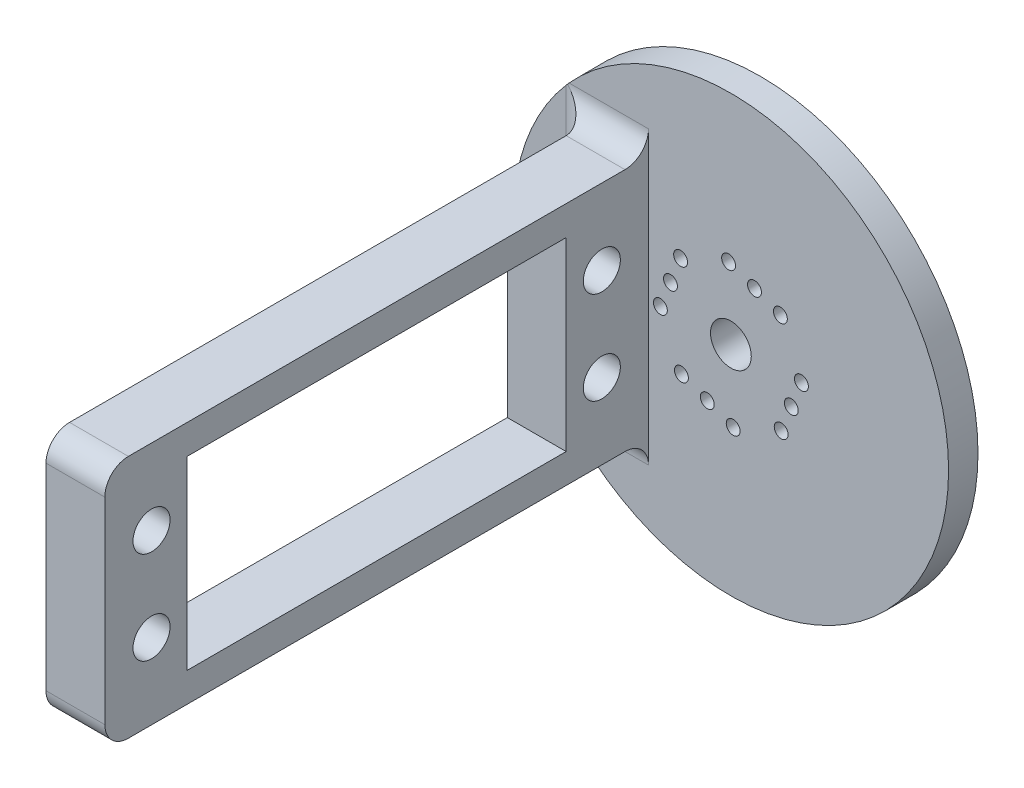
ISO-10303-21;
HEADER;
FILE_DESCRIPTION(('STEP AP214'),'2;1');
FILE_NAME('part.step','',(''),(''),'','','');
FILE_SCHEMA(('AUTOMOTIVE_DESIGN { 1 0 10303 214 1 1 1 1 }'));
ENDSEC;
DATA;
#1=APPLICATION_CONTEXT('core data for automotive mechanical design processes');
#2=APPLICATION_PROTOCOL_DEFINITION('international standard','automotive_design',2000,#1);
#3=PRODUCT_CONTEXT('',#1,'mechanical');
#4=PRODUCT('Part','Part','',(#3));
#5=PRODUCT_RELATED_PRODUCT_CATEGORY('part','',(#4));
#6=PRODUCT_DEFINITION_FORMATION('','',#4);
#7=PRODUCT_DEFINITION_CONTEXT('part definition',#1,'design');
#8=PRODUCT_DEFINITION('design','',#6,#7);
#9=PRODUCT_DEFINITION_SHAPE('','',#8);
#10=(LENGTH_UNIT() NAMED_UNIT(*) SI_UNIT(.MILLI.,.METRE.));
#11=(NAMED_UNIT(*) PLANE_ANGLE_UNIT() SI_UNIT($,.RADIAN.));
#12=(NAMED_UNIT(*) SI_UNIT($,.STERADIAN.) SOLID_ANGLE_UNIT());
#13=UNCERTAINTY_MEASURE_WITH_UNIT(LENGTH_MEASURE(1.E-05),#10,'distance_accuracy_value','');
#14=(GEOMETRIC_REPRESENTATION_CONTEXT(3) GLOBAL_UNCERTAINTY_ASSIGNED_CONTEXT((#13)) GLOBAL_UNIT_ASSIGNED_CONTEXT((#10,
#11,#12)) REPRESENTATION_CONTEXT('',''));
#15=CARTESIAN_POINT('',(0.,0.,0.));
#16=DIRECTION('',(0.,0.,1.));
#17=DIRECTION('',(1.,0.,0.));
#18=AXIS2_PLACEMENT_3D('',#15,#16,#17);
#19=CARTESIAN_POINT('',(0.,0.,3.175));
#20=DIRECTION('',(0.,0.,1.));
#21=DIRECTION('',(1.,0.,0.));
#22=AXIS2_PLACEMENT_3D('',#19,#20,#21);
#23=PLANE('',#22);
#24=CARTESIAN_POINT('',(0.,0.,3.175));
#25=DIRECTION('',(0.,0.,1.));
#26=DIRECTION('',(1.,0.,0.));
#27=AXIS2_PLACEMENT_3D('',#24,#25,#26);
#28=CIRCLE('',#27,2.2);
#29=CARTESIAN_POINT('',(2.2,0.,3.175));
#30=VERTEX_POINT('',#29);
#31=EDGE_CURVE('E432',#30,#30,#28,.T.);
#32=ORIENTED_EDGE('',*,*,#31,.F.);
#33=EDGE_LOOP('',(#32));
#34=FACE_BOUND('',#33,.T.);
#35=CARTESIAN_POINT('',(-2.54776954508794,-6.51988269412283,3.175));
#36=DIRECTION('',(0.,0.,1.));
#37=DIRECTION('',(1.,0.,0.));
#38=AXIS2_PLACEMENT_3D('',#35,#36,#37);
#39=CIRCLE('',#38,0.749999999999999);
#40=CARTESIAN_POINT('',(-1.79776954508794,-6.51988269412283,3.175));
#41=VERTEX_POINT('',#40);
#42=EDGE_CURVE('E436',#41,#41,#39,.F.);
#43=ORIENTED_EDGE('',*,*,#42,.T.);
#44=EDGE_LOOP('',(#43));
#45=FACE_BOUND('',#44,.T.);
#46=CARTESIAN_POINT('',(0.24646589525042,-7.61178392773195,3.175));
#47=DIRECTION('',(0.,0.,1.));
#48=DIRECTION('',(1.,0.,0.));
#49=AXIS2_PLACEMENT_3D('',#46,#47,#48);
#50=CIRCLE('',#49,0.749999999999999);
#51=CARTESIAN_POINT('',(0.996465895250419,-7.61178392773195,3.175));
#52=VERTEX_POINT('',#51);
#53=EDGE_CURVE('E440',#52,#52,#50,.F.);
#54=ORIENTED_EDGE('',*,*,#53,.T.);
#55=EDGE_LOOP('',(#54));
#56=FACE_BOUND('',#55,.T.);
#57=CARTESIAN_POINT('',(5.42798146051372,-5.34200498542629,3.175));
#58=DIRECTION('',(0.,0.,1.));
#59=DIRECTION('',(1.,0.,0.));
#60=AXIS2_PLACEMENT_3D('',#57,#58,#59);
#61=CIRCLE('',#60,0.749999999999999);
#62=CARTESIAN_POINT('',(6.17798146051372,-5.34200498542629,3.175));
#63=VERTEX_POINT('',#62);
#64=EDGE_CURVE('E444',#63,#63,#61,.F.);
#65=ORIENTED_EDGE('',*,*,#64,.T.);
#66=EDGE_LOOP('',(#65));
#67=FACE_BOUND('',#66,.T.);
#68=CARTESIAN_POINT('',(6.51988269412283,-2.54776954508794,3.175));
#69=DIRECTION('',(0.,0.,1.));
#70=DIRECTION('',(1.,0.,0.));
#71=AXIS2_PLACEMENT_3D('',#68,#69,#70);
#72=CIRCLE('',#71,0.749999999999999);
#73=CARTESIAN_POINT('',(7.26988269412283,-2.54776954508794,3.175));
#74=VERTEX_POINT('',#73);
#75=EDGE_CURVE('E448',#74,#74,#72,.F.);
#76=ORIENTED_EDGE('',*,*,#75,.T.);
#77=EDGE_LOOP('',(#76));
#78=FACE_BOUND('',#77,.T.);
#79=CARTESIAN_POINT('',(7.61178392773195,0.246465895250422,3.175));
#80=DIRECTION('',(0.,0.,1.));
#81=DIRECTION('',(1.,0.,0.));
#82=AXIS2_PLACEMENT_3D('',#79,#80,#81);
#83=CIRCLE('',#82,0.749999999999999);
#84=CARTESIAN_POINT('',(8.36178392773195,0.246465895250422,3.175));
#85=VERTEX_POINT('',#84);
#86=EDGE_CURVE('E452',#85,#85,#83,.F.);
#87=ORIENTED_EDGE('',*,*,#86,.T.);
#88=EDGE_LOOP('',(#87));
#89=FACE_BOUND('',#88,.T.);
#90=CARTESIAN_POINT('',(5.34200498542629,5.42798146051372,3.175));
#91=DIRECTION('',(0.,0.,1.));
#92=DIRECTION('',(1.,0.,0.));
#93=AXIS2_PLACEMENT_3D('',#90,#91,#92);
#94=CIRCLE('',#93,0.749999999999999);
#95=CARTESIAN_POINT('',(6.09200498542629,5.42798146051372,3.175));
#96=VERTEX_POINT('',#95);
#97=EDGE_CURVE('E456',#96,#96,#94,.F.);
#98=ORIENTED_EDGE('',*,*,#97,.T.);
#99=EDGE_LOOP('',(#98));
#100=FACE_BOUND('',#99,.T.);
#101=CARTESIAN_POINT('',(2.54776954508794,6.51988269412283,3.175));
#102=DIRECTION('',(0.,0.,1.));
#103=DIRECTION('',(1.,0.,0.));
#104=AXIS2_PLACEMENT_3D('',#101,#102,#103);
#105=CIRCLE('',#104,0.750000000000001);
#106=CARTESIAN_POINT('',(3.29776954508794,6.51988269412283,3.175));
#107=VERTEX_POINT('',#106);
#108=EDGE_CURVE('E460',#107,#107,#105,.F.);
#109=ORIENTED_EDGE('',*,*,#108,.T.);
#110=EDGE_LOOP('',(#109));
#111=FACE_BOUND('',#110,.T.);
#112=CARTESIAN_POINT('',(-0.246465895250421,7.61178392773195,3.175));
#113=DIRECTION('',(0.,0.,1.));
#114=DIRECTION('',(1.,0.,0.));
#115=AXIS2_PLACEMENT_3D('',#112,#113,#114);
#116=CIRCLE('',#115,0.75);
#117=CARTESIAN_POINT('',(0.503534104749579,7.61178392773195,3.175));
#118=VERTEX_POINT('',#117);
#119=EDGE_CURVE('E464',#118,#118,#116,.F.);
#120=ORIENTED_EDGE('',*,*,#119,.T.);
#121=EDGE_LOOP('',(#120));
#122=FACE_BOUND('',#121,.T.);
#123=CARTESIAN_POINT('',(-5.42798146051372,5.34200498542629,3.175));
#124=DIRECTION('',(0.,0.,1.));
#125=DIRECTION('',(1.,0.,0.));
#126=AXIS2_PLACEMENT_3D('',#123,#124,#125);
#127=CIRCLE('',#126,0.749999999999999);
#128=CARTESIAN_POINT('',(-4.67798146051372,5.34200498542629,3.175));
#129=VERTEX_POINT('',#128);
#130=EDGE_CURVE('E468',#129,#129,#127,.F.);
#131=ORIENTED_EDGE('',*,*,#130,.T.);
#132=EDGE_LOOP('',(#131));
#133=FACE_BOUND('',#132,.T.);
#134=CARTESIAN_POINT('',(-6.51988269412283,2.54776954508794,3.175));
#135=DIRECTION('',(0.,0.,1.));
#136=DIRECTION('',(1.,0.,0.));
#137=AXIS2_PLACEMENT_3D('',#134,#135,#136);
#138=CIRCLE('',#137,0.749999999999999);
#139=CARTESIAN_POINT('',(-5.76988269412283,2.54776954508794,3.175));
#140=VERTEX_POINT('',#139);
#141=EDGE_CURVE('E472',#140,#140,#138,.F.);
#142=ORIENTED_EDGE('',*,*,#141,.T.);
#143=EDGE_LOOP('',(#142));
#144=FACE_BOUND('',#143,.T.);
#145=CARTESIAN_POINT('',(-7.61178392773195,-0.246465895250421,3.175));
#146=DIRECTION('',(0.,0.,1.));
#147=DIRECTION('',(1.,0.,0.));
#148=AXIS2_PLACEMENT_3D('',#145,#146,#147);
#149=CIRCLE('',#148,0.749999999999999);
#150=CARTESIAN_POINT('',(-6.86178392773195,-0.246465895250421,3.175));
#151=VERTEX_POINT('',#150);
#152=EDGE_CURVE('E476',#151,#151,#149,.F.);
#153=ORIENTED_EDGE('',*,*,#152,.T.);
#154=EDGE_LOOP('',(#153));
#155=FACE_BOUND('',#154,.T.);
#156=CARTESIAN_POINT('',(-5.34200498542629,-5.42798146051372,3.175));
#157=DIRECTION('',(0.,0.,1.));
#158=DIRECTION('',(1.,0.,0.));
#159=AXIS2_PLACEMENT_3D('',#156,#157,#158);
#160=CIRCLE('',#159,0.750000000000001);
#161=CARTESIAN_POINT('',(-4.59200498542629,-5.42798146051372,3.175));
#162=VERTEX_POINT('',#161);
#163=EDGE_CURVE('E182',#162,#162,#160,.F.);
#164=ORIENTED_EDGE('',*,*,#163,.T.);
#165=EDGE_LOOP('',(#164));
#166=FACE_BOUND('',#165,.T.);
#167=CARTESIAN_POINT('',(0.,0.,3.175));
#168=DIRECTION('',(0.,0.,1.));
#169=DIRECTION('',(1.,0.,0.));
#170=AXIS2_PLACEMENT_3D('',#167,#168,#169);
#171=CIRCLE('',#170,23.495);
#172=CARTESIAN_POINT('',(-17.465789418174,-15.715,3.175));
#173=VERTEX_POINT('',#172);
#174=CARTESIAN_POINT('',(-17.465789418174,15.715,3.175));
#175=VERTEX_POINT('',#174);
#176=EDGE_CURVE('E263',#173,#175,#171,.T.);
#177=ORIENTED_EDGE('',*,*,#176,.T.);
#178=DIRECTION('',(1.,0.,0.));
#179=VECTOR('',#178,1.);
#180=CARTESIAN_POINT('',(-8.89,15.715,3.175));
#181=LINE('',#180,#179);
#182=CARTESIAN_POINT('',(-8.89,15.715,3.17500000000001));
#183=VERTEX_POINT('',#182);
#184=EDGE_CURVE('E277',#175,#183,#181,.T.);
#185=ORIENTED_EDGE('',*,*,#184,.T.);
#186=DIRECTION('',(0.,1.,0.));
#187=VECTOR('',#186,1.);
#188=CARTESIAN_POINT('',(-8.89,13.175,3.17500000000001));
#189=LINE('',#188,#187);
#190=CARTESIAN_POINT('',(-8.89,-15.715,3.175));
#191=VERTEX_POINT('',#190);
#192=EDGE_CURVE('E235',#191,#183,#189,.T.);
#193=ORIENTED_EDGE('',*,*,#192,.F.);
#194=DIRECTION('',(1.,0.,0.));
#195=VECTOR('',#194,1.);
#196=CARTESIAN_POINT('',(-15.24,-15.715,3.175));
#197=LINE('',#196,#195);
#198=EDGE_CURVE('E274',#191,#173,#197,.F.);
#199=ORIENTED_EDGE('',*,*,#198,.T.);
#200=EDGE_LOOP('',(#177,#185,#193,#199));
#201=FACE_BOUND('',#200,.T.);
#202=ADVANCED_FACE('F45',(#34,#45,#56,#67,#78,#89,#100,#111,#122,#133,#144,#155,#166,#201),#23,.T.);
#203=CARTESIAN_POINT('',(0.,0.,3.175));
#204=DIRECTION('',(0.,0.,-1.));
#205=DIRECTION('',(-1.,0.,0.));
#206=AXIS2_PLACEMENT_3D('',#203,#204,#205);
#207=CYLINDRICAL_SURFACE('',#206,23.495);
#208=CARTESIAN_POINT('',(-17.78,15.3586010105087,3.175));
#209=VERTEX_POINT('',#208);
#210=CARTESIAN_POINT('',(-17.78,-15.3586010105087,3.175));
#211=VERTEX_POINT('',#210);
#212=EDGE_CURVE('E267',#209,#211,#171,.T.);
#213=ORIENTED_EDGE('',*,*,#212,.F.);
#214=CARTESIAN_POINT('',(-17.78,15.3586010105087,3.175));
#215=CARTESIAN_POINT('',(-17.7524673102431,15.3904742718305,3.17499412421482));
#216=CARTESIAN_POINT('',(-17.7248558568099,15.4222657097279,3.17544447569739));
#217=CARTESIAN_POINT('',(-17.6694754225914,15.4856849386731,3.17725763319801));
#218=CARTESIAN_POINT('',(-17.6417064418061,15.517312729721,3.17862043921604));
#219=CARTESIAN_POINT('',(-17.6138586973444,15.5488586973445,3.18043947250181));
#220=B_SPLINE_CURVE_WITH_KNOTS('',3,(#214,#215,#216,#217,#218,#219),.UNSPECIFIED.,.F.,.F.,(4,2,
4),(0.,0.126331374988894,0.252662749975528),.UNSPECIFIED.);
#221=CARTESIAN_POINT('',(-17.6138586973444,15.5488586973445,3.18043947250181));
#222=VERTEX_POINT('',#221);
#223=EDGE_CURVE('E324',#209,#222,#220,.T.);
#224=ORIENTED_EDGE('',*,*,#223,.T.);
#225=CARTESIAN_POINT('',(-17.6138586973444,15.5488586973445,3.18043947250181));
#226=CARTESIAN_POINT('',(-17.5893264354966,15.5766491773507,3.17862230868545));
#227=CARTESIAN_POINT('',(-17.5647211979752,15.6043895259085,3.17726043740213));
#228=CARTESIAN_POINT('',(-17.5153647715851,15.659769960127,3.17544727990152));
#229=CARTESIAN_POINT('',(-17.4906135827163,15.6874100457878,3.17499599368424));
#230=CARTESIAN_POINT('',(-17.465789418174,15.715,3.175));
#231=B_SPLINE_CURVE_WITH_KNOTS('',3,(#225,#226,#227,#228,#229,#230),.UNSPECIFIED.,.F.,.F.,(4,2,
4),(0.,0.111315740597761,0.222631481196376),.UNSPECIFIED.);
#232=EDGE_CURVE('E295',#222,#175,#231,.T.);
#233=ORIENTED_EDGE('',*,*,#232,.T.);
#234=ORIENTED_EDGE('',*,*,#176,.F.);
#235=CARTESIAN_POINT('',(-17.465789418174,-15.715,3.175));
#236=CARTESIAN_POINT('',(-17.4906135827163,-15.6874100457878,3.17499599368424));
#237=CARTESIAN_POINT('',(-17.5153647715851,-15.659769960127,3.17544727990152));
#238=CARTESIAN_POINT('',(-17.5647211979752,-15.6043895259085,3.17726043740213));
#239=CARTESIAN_POINT('',(-17.5893264354966,-15.5766491773507,3.17862230868545));
#240=CARTESIAN_POINT('',(-17.6138586973444,-15.5488586973444,3.18043947250181));
#241=B_SPLINE_CURVE_WITH_KNOTS('',3,(#235,#236,#237,#238,#239,#240),.UNSPECIFIED.,.F.,.F.,(4,2,
4),(0.,0.111315740598613,0.222631481196368),.UNSPECIFIED.);
#242=CARTESIAN_POINT('',(-17.6138586973444,-15.5488586973444,3.18043947250181));
#243=VERTEX_POINT('',#242);
#244=EDGE_CURVE('E391',#173,#243,#241,.T.);
#245=ORIENTED_EDGE('',*,*,#244,.T.);
#246=CARTESIAN_POINT('',(-17.6138586973444,-15.5488586973444,3.18043947250181));
#247=CARTESIAN_POINT('',(-17.6417064418061,-15.517312729721,3.17862043921604));
#248=CARTESIAN_POINT('',(-17.6694754225914,-15.4856849386731,3.17725763319801));
#249=CARTESIAN_POINT('',(-17.7248558568099,-15.4222657097279,3.17544447569739));
#250=CARTESIAN_POINT('',(-17.7524673102431,-15.3904742718305,3.17499412421482));
#251=CARTESIAN_POINT('',(-17.78,-15.3586010105087,3.175));
#252=B_SPLINE_CURVE_WITH_KNOTS('',3,(#246,#247,#248,#249,#250,#251),.UNSPECIFIED.,.F.,.F.,(4,2,
4),(0.,0.12633137498663,0.252662749975517),.UNSPECIFIED.);
#253=EDGE_CURVE('E330',#243,#211,#252,.T.);
#254=ORIENTED_EDGE('',*,*,#253,.T.);
#255=EDGE_LOOP('',(#213,#224,#233,#234,#245,#254));
#256=FACE_BOUND('',#255,.T.);
#257=CARTESIAN_POINT('',(0.,0.,0.));
#258=DIRECTION('',(0.,0.,1.));
#259=DIRECTION('',(1.,0.,0.));
#260=AXIS2_PLACEMENT_3D('',#257,#258,#259);
#261=CIRCLE('',#260,23.495);
#262=CARTESIAN_POINT('',(23.495,0.,0.));
#263=VERTEX_POINT('',#262);
#264=EDGE_CURVE('E250',#263,#263,#261,.T.);
#265=ORIENTED_EDGE('',*,*,#264,.T.);
#266=EDGE_LOOP('',(#265));
#267=FACE_BOUND('',#266,.T.);
#268=ADVANCED_FACE('F306',(#256,#267),#207,.T.);
#269=ORIENTED_EDGE('',*,*,#212,.T.);
#270=DIRECTION('',(0.,1.,0.));
#271=VECTOR('',#270,1.);
#272=CARTESIAN_POINT('',(-17.78,13.175,3.175));
#273=LINE('',#272,#271);
#274=EDGE_CURVE('E271',#211,#209,#273,.T.);
#275=ORIENTED_EDGE('',*,*,#274,.T.);
#276=EDGE_LOOP('',(#269,#275));
#277=FACE_BOUND('',#276,.T.);
#278=ADVANCED_FACE('F412',(#277),#23,.T.);
#279=CARTESIAN_POINT('',(0.,0.,0.));
#280=DIRECTION('',(0.,0.,1.));
#281=DIRECTION('',(1.,0.,0.));
#282=AXIS2_PLACEMENT_3D('',#279,#280,#281);
#283=PLANE('',#282);
#284=CARTESIAN_POINT('',(0.,0.,0.));
#285=DIRECTION('',(0.,0.,1.));
#286=DIRECTION('',(1.,0.,0.));
#287=AXIS2_PLACEMENT_3D('',#284,#285,#286);
#288=CIRCLE('',#287,2.2);
#289=CARTESIAN_POINT('',(2.2,0.,0.));
#290=VERTEX_POINT('',#289);
#291=EDGE_CURVE('E557',#290,#290,#288,.T.);
#292=ORIENTED_EDGE('',*,*,#291,.T.);
#293=EDGE_LOOP('',(#292));
#294=FACE_BOUND('',#293,.T.);
#295=CARTESIAN_POINT('',(-2.54776954508794,-6.51988269412283,0.));
#296=DIRECTION('',(0.,0.,-1.));
#297=DIRECTION('',(-1.,0.,0.));
#298=AXIS2_PLACEMENT_3D('',#295,#296,#297);
#299=CIRCLE('',#298,0.749999999999999);
#300=CARTESIAN_POINT('',(-3.29776954508794,-6.51988269412283,0.));
#301=VERTEX_POINT('',#300);
#302=EDGE_CURVE('E481',#301,#301,#299,.T.);
#303=ORIENTED_EDGE('',*,*,#302,.F.);
#304=EDGE_LOOP('',(#303));
#305=FACE_BOUND('',#304,.T.);
#306=CARTESIAN_POINT('',(0.24646589525042,-7.61178392773195,0.));
#307=DIRECTION('',(0.,0.,-1.));
#308=DIRECTION('',(-1.,0.,0.));
#309=AXIS2_PLACEMENT_3D('',#306,#307,#308);
#310=CIRCLE('',#309,0.749999999999999);
#311=CARTESIAN_POINT('',(-0.503534104749579,-7.61178392773195,0.));
#312=VERTEX_POINT('',#311);
#313=EDGE_CURVE('E490',#312,#312,#310,.T.);
#314=ORIENTED_EDGE('',*,*,#313,.F.);
#315=EDGE_LOOP('',(#314));
#316=FACE_BOUND('',#315,.T.);
#317=CARTESIAN_POINT('',(5.42798146051372,-5.34200498542629,0.));
#318=DIRECTION('',(0.,0.,-1.));
#319=DIRECTION('',(-1.,0.,0.));
#320=AXIS2_PLACEMENT_3D('',#317,#318,#319);
#321=CIRCLE('',#320,0.749999999999999);
#322=CARTESIAN_POINT('',(4.67798146051372,-5.34200498542629,0.));
#323=VERTEX_POINT('',#322);
#324=EDGE_CURVE('E500',#323,#323,#321,.T.);
#325=ORIENTED_EDGE('',*,*,#324,.F.);
#326=EDGE_LOOP('',(#325));
#327=FACE_BOUND('',#326,.T.);
#328=CARTESIAN_POINT('',(6.51988269412283,-2.54776954508794,0.));
#329=DIRECTION('',(0.,0.,-1.));
#330=DIRECTION('',(-1.,0.,0.));
#331=AXIS2_PLACEMENT_3D('',#328,#329,#330);
#332=CIRCLE('',#331,0.749999999999999);
#333=CARTESIAN_POINT('',(5.76988269412283,-2.54776954508794,0.));
#334=VERTEX_POINT('',#333);
#335=EDGE_CURVE('E506',#334,#334,#332,.T.);
#336=ORIENTED_EDGE('',*,*,#335,.F.);
#337=EDGE_LOOP('',(#336));
#338=FACE_BOUND('',#337,.T.);
#339=CARTESIAN_POINT('',(7.61178392773195,0.246465895250422,0.));
#340=DIRECTION('',(0.,0.,-1.));
#341=DIRECTION('',(-1.,0.,0.));
#342=AXIS2_PLACEMENT_3D('',#339,#340,#341);
#343=CIRCLE('',#342,0.749999999999999);
#344=CARTESIAN_POINT('',(6.86178392773195,0.246465895250422,0.));
#345=VERTEX_POINT('',#344);
#346=EDGE_CURVE('E512',#345,#345,#343,.T.);
#347=ORIENTED_EDGE('',*,*,#346,.F.);
#348=EDGE_LOOP('',(#347));
#349=FACE_BOUND('',#348,.T.);
#350=CARTESIAN_POINT('',(5.34200498542629,5.42798146051372,0.));
#351=DIRECTION('',(0.,0.,-1.));
#352=DIRECTION('',(-1.,0.,0.));
#353=AXIS2_PLACEMENT_3D('',#350,#351,#352);
#354=CIRCLE('',#353,0.749999999999999);
#355=CARTESIAN_POINT('',(4.59200498542629,5.42798146051372,0.));
#356=VERTEX_POINT('',#355);
#357=EDGE_CURVE('E518',#356,#356,#354,.T.);
#358=ORIENTED_EDGE('',*,*,#357,.F.);
#359=EDGE_LOOP('',(#358));
#360=FACE_BOUND('',#359,.T.);
#361=CARTESIAN_POINT('',(2.54776954508794,6.51988269412283,0.));
#362=DIRECTION('',(0.,0.,-1.));
#363=DIRECTION('',(-1.,0.,0.));
#364=AXIS2_PLACEMENT_3D('',#361,#362,#363);
#365=CIRCLE('',#364,0.750000000000001);
#366=CARTESIAN_POINT('',(1.79776954508794,6.51988269412283,0.));
#367=VERTEX_POINT('',#366);
#368=EDGE_CURVE('E524',#367,#367,#365,.T.);
#369=ORIENTED_EDGE('',*,*,#368,.F.);
#370=EDGE_LOOP('',(#369));
#371=FACE_BOUND('',#370,.T.);
#372=CARTESIAN_POINT('',(-0.246465895250421,7.61178392773195,0.));
#373=DIRECTION('',(0.,0.,-1.));
#374=DIRECTION('',(-1.,0.,0.));
#375=AXIS2_PLACEMENT_3D('',#372,#373,#374);
#376=CIRCLE('',#375,0.75);
#377=CARTESIAN_POINT('',(-0.996465895250421,7.61178392773195,0.));
#378=VERTEX_POINT('',#377);
#379=EDGE_CURVE('E530',#378,#378,#376,.T.);
#380=ORIENTED_EDGE('',*,*,#379,.F.);
#381=EDGE_LOOP('',(#380));
#382=FACE_BOUND('',#381,.T.);
#383=CARTESIAN_POINT('',(-5.42798146051372,5.34200498542629,0.));
#384=DIRECTION('',(0.,0.,-1.));
#385=DIRECTION('',(-1.,0.,0.));
#386=AXIS2_PLACEMENT_3D('',#383,#384,#385);
#387=CIRCLE('',#386,0.749999999999999);
#388=CARTESIAN_POINT('',(-6.17798146051372,5.34200498542629,0.));
#389=VERTEX_POINT('',#388);
#390=EDGE_CURVE('E535',#389,#389,#387,.T.);
#391=ORIENTED_EDGE('',*,*,#390,.F.);
#392=EDGE_LOOP('',(#391));
#393=FACE_BOUND('',#392,.T.);
#394=CARTESIAN_POINT('',(-6.51988269412283,2.54776954508794,0.));
#395=DIRECTION('',(0.,0.,-1.));
#396=DIRECTION('',(-1.,0.,0.));
#397=AXIS2_PLACEMENT_3D('',#394,#395,#396);
#398=CIRCLE('',#397,0.749999999999999);
#399=CARTESIAN_POINT('',(-7.26988269412283,2.54776954508794,0.));
#400=VERTEX_POINT('',#399);
#401=EDGE_CURVE('E542',#400,#400,#398,.T.);
#402=ORIENTED_EDGE('',*,*,#401,.F.);
#403=EDGE_LOOP('',(#402));
#404=FACE_BOUND('',#403,.T.);
#405=CARTESIAN_POINT('',(-7.61178392773195,-0.246465895250421,0.));
#406=DIRECTION('',(0.,0.,-1.));
#407=DIRECTION('',(-1.,0.,0.));
#408=AXIS2_PLACEMENT_3D('',#405,#406,#407);
#409=CIRCLE('',#408,0.749999999999999);
#410=CARTESIAN_POINT('',(-8.36178392773195,-0.246465895250421,0.));
#411=VERTEX_POINT('',#410);
#412=EDGE_CURVE('E551',#411,#411,#409,.T.);
#413=ORIENTED_EDGE('',*,*,#412,.F.);
#414=EDGE_LOOP('',(#413));
#415=FACE_BOUND('',#414,.T.);
#416=CARTESIAN_POINT('',(-5.34200498542629,-5.42798146051372,0.));
#417=DIRECTION('',(0.,0.,-1.));
#418=DIRECTION('',(-1.,0.,0.));
#419=AXIS2_PLACEMENT_3D('',#416,#417,#418);
#420=CIRCLE('',#419,0.750000000000001);
#421=CARTESIAN_POINT('',(-6.0920049854263,-5.42798146051372,0.));
#422=VERTEX_POINT('',#421);
#423=EDGE_CURVE('E342',#422,#422,#420,.T.);
#424=ORIENTED_EDGE('',*,*,#423,.F.);
#425=EDGE_LOOP('',(#424));
#426=FACE_BOUND('',#425,.T.);
#427=ORIENTED_EDGE('',*,*,#264,.F.);
#428=EDGE_LOOP('',(#427));
#429=FACE_BOUND('',#428,.T.);
#430=ADVANCED_FACE('F415',(#294,#305,#316,#327,#338,#349,#360,#371,#382,#393,#404,#415,#426,
#429),#283,.F.);
#431=CARTESIAN_POINT('',(-15.24,-13.175,3.175));
#432=DIRECTION('',(0.,-1.,0.));
#433=DIRECTION('',(0.,0.,-1.));
#434=AXIS2_PLACEMENT_3D('',#431,#432,#433);
#435=PLANE('',#434);
#436=DIRECTION('',(0.,0.,-1.));
#437=VECTOR('',#436,1.);
#438=CARTESIAN_POINT('',(-8.89,-13.175,3.175));
#439=LINE('',#438,#437);
#440=CARTESIAN_POINT('',(-8.89,-13.175,59.315));
#441=VERTEX_POINT('',#440);
#442=CARTESIAN_POINT('',(-8.89,-13.175,5.715));
#443=VERTEX_POINT('',#442);
#444=EDGE_CURVE('E244',#441,#443,#439,.T.);
#445=ORIENTED_EDGE('',*,*,#444,.F.);
#446=DIRECTION('',(1.,0.,0.));
#447=VECTOR('',#446,1.);
#448=CARTESIAN_POINT('',(-15.24,-13.175,59.315));
#449=LINE('',#448,#447);
#450=CARTESIAN_POINT('',(-15.24,-13.175,59.315));
#451=VERTEX_POINT('',#450);
#452=EDGE_CURVE('E11',#441,#451,#449,.F.);
#453=ORIENTED_EDGE('',*,*,#452,.T.);
#454=DIRECTION('',(0.,0.,-1.));
#455=VECTOR('',#454,1.);
#456=CARTESIAN_POINT('',(-15.24,-13.175,3.175));
#457=LINE('',#456,#455);
#458=CARTESIAN_POINT('',(-15.24,-13.175,5.715));
#459=VERTEX_POINT('',#458);
#460=EDGE_CURVE('E247',#451,#459,#457,.T.);
#461=ORIENTED_EDGE('',*,*,#460,.T.);
#462=DIRECTION('',(1.,0.,0.));
#463=VECTOR('',#462,1.);
#464=CARTESIAN_POINT('',(-8.89,-13.175,5.715));
#465=LINE('',#464,#463);
#466=EDGE_CURVE('E284',#459,#443,#465,.T.);
#467=ORIENTED_EDGE('',*,*,#466,.T.);
#468=EDGE_LOOP('',(#445,#453,#461,#467));
#469=FACE_BOUND('',#468,.T.);
#470=ADVANCED_FACE('F383',(#469),#435,.T.);
#471=CARTESIAN_POINT('',(-15.24,13.175,61.855));
#472=DIRECTION('',(0.,0.,1.));
#473=DIRECTION('',(0.,-1.,0.));
#474=AXIS2_PLACEMENT_3D('',#471,#472,#473);
#475=PLANE('',#474);
#476=DIRECTION('',(0.,-1.,0.));
#477=VECTOR('',#476,1.);
#478=CARTESIAN_POINT('',(-8.89,13.175,61.855));
#479=LINE('',#478,#477);
#480=CARTESIAN_POINT('',(-8.89,10.635,61.855));
#481=VERTEX_POINT('',#480);
#482=CARTESIAN_POINT('',(-8.89,-10.635,61.855));
#483=VERTEX_POINT('',#482);
#484=EDGE_CURVE('E257',#481,#483,#479,.T.);
#485=ORIENTED_EDGE('',*,*,#484,.F.);
#486=DIRECTION('',(1.,0.,0.));
#487=VECTOR('',#486,1.);
#488=CARTESIAN_POINT('',(-15.24,10.635,61.855));
#489=LINE('',#488,#487);
#490=CARTESIAN_POINT('',(-15.24,10.635,61.855));
#491=VERTEX_POINT('',#490);
#492=EDGE_CURVE('E359',#481,#491,#489,.F.);
#493=ORIENTED_EDGE('',*,*,#492,.T.);
#494=DIRECTION('',(0.,-1.,0.));
#495=VECTOR('',#494,1.);
#496=CARTESIAN_POINT('',(-15.24,13.175,61.855));
#497=LINE('',#496,#495);
#498=CARTESIAN_POINT('',(-15.24,-10.635,61.855));
#499=VERTEX_POINT('',#498);
#500=EDGE_CURVE('E243',#491,#499,#497,.T.);
#501=ORIENTED_EDGE('',*,*,#500,.T.);
#502=DIRECTION('',(1.,0.,0.));
#503=VECTOR('',#502,1.);
#504=CARTESIAN_POINT('',(-15.24,-10.635,61.855));
#505=LINE('',#504,#503);
#506=EDGE_CURVE('E355',#499,#483,#505,.T.);
#507=ORIENTED_EDGE('',*,*,#506,.T.);
#508=EDGE_LOOP('',(#485,#493,#501,#507));
#509=FACE_BOUND('',#508,.T.);
#510=ADVANCED_FACE('F379',(#509),#475,.T.);
#511=CARTESIAN_POINT('',(-15.24,13.175,3.17500000000001));
#512=DIRECTION('',(0.,1.,0.));
#513=DIRECTION('',(0.,0.,1.));
#514=AXIS2_PLACEMENT_3D('',#511,#512,#513);
#515=PLANE('',#514);
#516=DIRECTION('',(0.,0.,1.));
#517=VECTOR('',#516,1.);
#518=CARTESIAN_POINT('',(-15.24,13.175,3.17500000000001));
#519=LINE('',#518,#517);
#520=CARTESIAN_POINT('',(-15.24,13.175,5.715));
#521=VERTEX_POINT('',#520);
#522=CARTESIAN_POINT('',(-15.24,13.175,59.315));
#523=VERTEX_POINT('',#522);
#524=EDGE_CURVE('E239',#521,#523,#519,.T.);
#525=ORIENTED_EDGE('',*,*,#524,.T.);
#526=DIRECTION('',(1.,0.,0.));
#527=VECTOR('',#526,1.);
#528=CARTESIAN_POINT('',(-15.24,13.175,59.315));
#529=LINE('',#528,#527);
#530=CARTESIAN_POINT('',(-8.89,13.175,59.315));
#531=VERTEX_POINT('',#530);
#532=EDGE_CURVE('E337',#523,#531,#529,.T.);
#533=ORIENTED_EDGE('',*,*,#532,.T.);
#534=DIRECTION('',(0.,0.,1.));
#535=VECTOR('',#534,1.);
#536=CARTESIAN_POINT('',(-8.89,13.175,3.17500000000001));
#537=LINE('',#536,#535);
#538=CARTESIAN_POINT('',(-8.89,13.175,5.715));
#539=VERTEX_POINT('',#538);
#540=EDGE_CURVE('E253',#539,#531,#537,.T.);
#541=ORIENTED_EDGE('',*,*,#540,.F.);
#542=DIRECTION('',(1.,0.,0.));
#543=VECTOR('',#542,1.);
#544=CARTESIAN_POINT('',(-15.24,13.175,5.715));
#545=LINE('',#544,#543);
#546=EDGE_CURVE('E281',#539,#521,#545,.F.);
#547=ORIENTED_EDGE('',*,*,#546,.T.);
#548=EDGE_LOOP('',(#525,#533,#541,#547));
#549=FACE_BOUND('',#548,.T.);
#550=ADVANCED_FACE('F371',(#549),#515,.T.);
#551=CARTESIAN_POINT('',(-15.24,0.,0.));
#552=DIRECTION('',(-1.,0.,0.));
#553=DIRECTION('',(0.,0.,1.));
#554=AXIS2_PLACEMENT_3D('',#551,#552,#553);
#555=PLANE('',#554);
#556=DIRECTION('',(0.,0.,-1.));
#557=VECTOR('',#556,1.);
#558=CARTESIAN_POINT('',(-15.24,-10.,12.065));
#559=LINE('',#558,#557);
#560=CARTESIAN_POINT('',(-15.24,-10.,52.965));
#561=VERTEX_POINT('',#560);
#562=CARTESIAN_POINT('',(-15.24,-10.,12.065));
#563=VERTEX_POINT('',#562);
#564=EDGE_CURVE('E151',#561,#563,#559,.T.);
#565=ORIENTED_EDGE('',*,*,#564,.T.);
#566=DIRECTION('',(0.,1.,0.));
#567=VECTOR('',#566,1.);
#568=CARTESIAN_POINT('',(-15.24,-10.,12.065));
#569=LINE('',#568,#567);
#570=CARTESIAN_POINT('',(-15.24,10.,12.065));
#571=VERTEX_POINT('',#570);
#572=EDGE_CURVE('E164',#563,#571,#569,.T.);
#573=ORIENTED_EDGE('',*,*,#572,.T.);
#574=DIRECTION('',(0.,0.,1.));
#575=VECTOR('',#574,1.);
#576=CARTESIAN_POINT('',(-15.24,10.,12.065));
#577=LINE('',#576,#575);
#578=CARTESIAN_POINT('',(-15.24,9.99999999999998,52.965));
#579=VERTEX_POINT('',#578);
#580=EDGE_CURVE('E169',#571,#579,#577,.T.);
#581=ORIENTED_EDGE('',*,*,#580,.T.);
#582=DIRECTION('',(0.,-1.,0.));
#583=VECTOR('',#582,1.);
#584=CARTESIAN_POINT('',(-15.24,-10.,52.965));
#585=LINE('',#584,#583);
#586=EDGE_CURVE('E160',#579,#561,#585,.T.);
#587=ORIENTED_EDGE('',*,*,#586,.T.);
#588=EDGE_LOOP('',(#565,#573,#581,#587));
#589=FACE_BOUND('',#588,.T.);
#590=CARTESIAN_POINT('',(-15.24,4.99999999999998,8.21500000000001));
#591=DIRECTION('',(1.,0.,0.));
#592=DIRECTION('',(0.,0.,-1.));
#593=AXIS2_PLACEMENT_3D('',#590,#591,#592);
#594=CIRCLE('',#593,2.);
#595=CARTESIAN_POINT('',(-15.24,4.99999999999998,6.215));
#596=VERTEX_POINT('',#595);
#597=EDGE_CURVE('E207',#596,#596,#594,.T.);
#598=ORIENTED_EDGE('',*,*,#597,.T.);
#599=EDGE_LOOP('',(#598));
#600=FACE_BOUND('',#599,.T.);
#601=CARTESIAN_POINT('',(-15.24,-5.00000000000002,8.21500000000001));
#602=DIRECTION('',(1.,0.,0.));
#603=DIRECTION('',(0.,0.,-1.));
#604=AXIS2_PLACEMENT_3D('',#601,#602,#603);
#605=CIRCLE('',#604,2.00000000000001);
#606=CARTESIAN_POINT('',(-15.24,-5.00000000000002,6.215));
#607=VERTEX_POINT('',#606);
#608=EDGE_CURVE('E215',#607,#607,#605,.T.);
#609=ORIENTED_EDGE('',*,*,#608,.T.);
#610=EDGE_LOOP('',(#609));
#611=FACE_BOUND('',#610,.T.);
#612=CARTESIAN_POINT('',(-15.24,4.99999999999997,56.815));
#613=DIRECTION('',(1.,0.,0.));
#614=DIRECTION('',(0.,0.,-1.));
#615=AXIS2_PLACEMENT_3D('',#612,#613,#614);
#616=CIRCLE('',#615,2.);
#617=CARTESIAN_POINT('',(-15.24,4.99999999999997,54.815));
#618=VERTEX_POINT('',#617);
#619=EDGE_CURVE('E223',#618,#618,#616,.T.);
#620=ORIENTED_EDGE('',*,*,#619,.T.);
#621=EDGE_LOOP('',(#620));
#622=FACE_BOUND('',#621,.T.);
#623=CARTESIAN_POINT('',(-15.24,-5.00000000000003,56.815));
#624=DIRECTION('',(1.,0.,0.));
#625=DIRECTION('',(0.,0.,-1.));
#626=AXIS2_PLACEMENT_3D('',#623,#624,#625);
#627=CIRCLE('',#626,2.00000000000002);
#628=CARTESIAN_POINT('',(-15.24,-5.00000000000003,54.815));
#629=VERTEX_POINT('',#628);
#630=EDGE_CURVE('E231',#629,#629,#627,.T.);
#631=ORIENTED_EDGE('',*,*,#630,.T.);
#632=EDGE_LOOP('',(#631));
#633=FACE_BOUND('',#632,.T.);
#634=ORIENTED_EDGE('',*,*,#500,.F.);
#635=CARTESIAN_POINT('',(-15.24,10.635,59.315));
#636=DIRECTION('',(-1.,0.,0.));
#637=DIRECTION('',(0.,0.,1.));
#638=AXIS2_PLACEMENT_3D('',#635,#636,#637);
#639=CIRCLE('',#638,2.54);
#640=EDGE_CURVE('E54',#491,#523,#639,.T.);
#641=ORIENTED_EDGE('',*,*,#640,.T.);
#642=ORIENTED_EDGE('',*,*,#524,.F.);
#643=DIRECTION('',(0.,1.,0.));
#644=VECTOR('',#643,1.);
#645=CARTESIAN_POINT('',(-15.24,-13.175,5.715));
#646=LINE('',#645,#644);
#647=EDGE_CURVE('E288',#521,#459,#646,.F.);
#648=ORIENTED_EDGE('',*,*,#647,.T.);
#649=ORIENTED_EDGE('',*,*,#460,.F.);
#650=CARTESIAN_POINT('',(-15.24,-10.635,59.315));
#651=DIRECTION('',(-1.,0.,0.));
#652=DIRECTION('',(0.,0.,1.));
#653=AXIS2_PLACEMENT_3D('',#650,#651,#652);
#654=CIRCLE('',#653,2.54);
#655=EDGE_CURVE('E66',#451,#499,#654,.T.);
#656=ORIENTED_EDGE('',*,*,#655,.T.);
#657=EDGE_LOOP('',(#634,#641,#642,#648,#649,#656));
#658=FACE_BOUND('',#657,.T.);
#659=ADVANCED_FACE('F171',(#589,#600,#611,#622,#633,#658),#555,.T.);
#660=CARTESIAN_POINT('',(-8.89,0.,0.));
#661=DIRECTION('',(-1.,0.,0.));
#662=DIRECTION('',(0.,0.,1.));
#663=AXIS2_PLACEMENT_3D('',#660,#661,#662);
#664=PLANE('',#663);
#665=DIRECTION('',(0.,1.,0.));
#666=VECTOR('',#665,1.);
#667=CARTESIAN_POINT('',(-8.89,-10.,12.065));
#668=LINE('',#667,#666);
#669=CARTESIAN_POINT('',(-8.89,-10.,12.065));
#670=VERTEX_POINT('',#669);
#671=CARTESIAN_POINT('',(-8.89,10.,12.065));
#672=VERTEX_POINT('',#671);
#673=EDGE_CURVE('E191',#670,#672,#668,.T.);
#674=ORIENTED_EDGE('',*,*,#673,.F.);
#675=DIRECTION('',(0.,0.,-1.));
#676=VECTOR('',#675,1.);
#677=CARTESIAN_POINT('',(-8.89,-10.,12.065));
#678=LINE('',#677,#676);
#679=CARTESIAN_POINT('',(-8.89,-10.,52.965));
#680=VERTEX_POINT('',#679);
#681=EDGE_CURVE('E154',#680,#670,#678,.T.);
#682=ORIENTED_EDGE('',*,*,#681,.F.);
#683=DIRECTION('',(0.,-1.,0.));
#684=VECTOR('',#683,1.);
#685=CARTESIAN_POINT('',(-8.89,-10.,52.965));
#686=LINE('',#685,#684);
#687=CARTESIAN_POINT('',(-8.89,9.99999999999998,52.965));
#688=VERTEX_POINT('',#687);
#689=EDGE_CURVE('E175',#688,#680,#686,.T.);
#690=ORIENTED_EDGE('',*,*,#689,.F.);
#691=DIRECTION('',(0.,0.,1.));
#692=VECTOR('',#691,1.);
#693=CARTESIAN_POINT('',(-8.89,10.,12.065));
#694=LINE('',#693,#692);
#695=EDGE_CURVE('E179',#672,#688,#694,.T.);
#696=ORIENTED_EDGE('',*,*,#695,.F.);
#697=EDGE_LOOP('',(#674,#682,#690,#696));
#698=FACE_BOUND('',#697,.T.);
#699=CARTESIAN_POINT('',(-8.89,4.99999999999998,8.21500000000001));
#700=DIRECTION('',(1.,0.,0.));
#701=DIRECTION('',(0.,0.,-1.));
#702=AXIS2_PLACEMENT_3D('',#699,#700,#701);
#703=CIRCLE('',#702,2.);
#704=CARTESIAN_POINT('',(-8.89,4.99999999999998,6.215));
#705=VERTEX_POINT('',#704);
#706=EDGE_CURVE('E201',#705,#705,#703,.T.);
#707=ORIENTED_EDGE('',*,*,#706,.F.);
#708=EDGE_LOOP('',(#707));
#709=FACE_BOUND('',#708,.T.);
#710=CARTESIAN_POINT('',(-8.89,-5.00000000000002,8.21500000000001));
#711=DIRECTION('',(1.,0.,0.));
#712=DIRECTION('',(0.,0.,-1.));
#713=AXIS2_PLACEMENT_3D('',#710,#711,#712);
#714=CIRCLE('',#713,2.00000000000001);
#715=CARTESIAN_POINT('',(-8.89,-5.00000000000002,6.215));
#716=VERTEX_POINT('',#715);
#717=EDGE_CURVE('E211',#716,#716,#714,.T.);
#718=ORIENTED_EDGE('',*,*,#717,.F.);
#719=EDGE_LOOP('',(#718));
#720=FACE_BOUND('',#719,.T.);
#721=CARTESIAN_POINT('',(-8.89,4.99999999999997,56.815));
#722=DIRECTION('',(1.,0.,0.));
#723=DIRECTION('',(0.,0.,-1.));
#724=AXIS2_PLACEMENT_3D('',#721,#722,#723);
#725=CIRCLE('',#724,2.);
#726=CARTESIAN_POINT('',(-8.89,4.99999999999997,54.815));
#727=VERTEX_POINT('',#726);
#728=EDGE_CURVE('E219',#727,#727,#725,.T.);
#729=ORIENTED_EDGE('',*,*,#728,.F.);
#730=EDGE_LOOP('',(#729));
#731=FACE_BOUND('',#730,.T.);
#732=CARTESIAN_POINT('',(-8.89,-5.00000000000003,56.815));
#733=DIRECTION('',(1.,0.,0.));
#734=DIRECTION('',(0.,0.,-1.));
#735=AXIS2_PLACEMENT_3D('',#732,#733,#734);
#736=CIRCLE('',#735,2.00000000000002);
#737=CARTESIAN_POINT('',(-8.89,-5.00000000000003,54.815));
#738=VERTEX_POINT('',#737);
#739=EDGE_CURVE('E227',#738,#738,#736,.T.);
#740=ORIENTED_EDGE('',*,*,#739,.F.);
#741=EDGE_LOOP('',(#740));
#742=FACE_BOUND('',#741,.T.);
#743=ORIENTED_EDGE('',*,*,#540,.T.);
#744=CARTESIAN_POINT('',(-8.89,10.635,59.315));
#745=DIRECTION('',(-1.,0.,0.));
#746=DIRECTION('',(0.,0.,1.));
#747=AXIS2_PLACEMENT_3D('',#744,#745,#746);
#748=CIRCLE('',#747,2.54);
#749=EDGE_CURVE('E352',#531,#481,#748,.F.);
#750=ORIENTED_EDGE('',*,*,#749,.T.);
#751=ORIENTED_EDGE('',*,*,#484,.T.);
#752=CARTESIAN_POINT('',(-8.89,-10.635,59.315));
#753=DIRECTION('',(-1.,0.,0.));
#754=DIRECTION('',(0.,0.,1.));
#755=AXIS2_PLACEMENT_3D('',#752,#753,#754);
#756=CIRCLE('',#755,2.54);
#757=EDGE_CURVE('E349',#483,#441,#756,.F.);
#758=ORIENTED_EDGE('',*,*,#757,.T.);
#759=ORIENTED_EDGE('',*,*,#444,.T.);
#760=CARTESIAN_POINT('',(-8.89,-15.715,5.715));
#761=DIRECTION('',(-1.,0.,0.));
#762=DIRECTION('',(0.,0.,1.));
#763=AXIS2_PLACEMENT_3D('',#760,#761,#762);
#764=CIRCLE('',#763,2.54);
#765=EDGE_CURVE('E304',#443,#191,#764,.T.);
#766=ORIENTED_EDGE('',*,*,#765,.T.);
#767=ORIENTED_EDGE('',*,*,#192,.T.);
#768=CARTESIAN_POINT('',(-8.89,15.715,5.715));
#769=DIRECTION('',(-1.,0.,0.));
#770=DIRECTION('',(0.,0.,1.));
#771=AXIS2_PLACEMENT_3D('',#768,#769,#770);
#772=CIRCLE('',#771,2.54);
#773=EDGE_CURVE('E292',#183,#539,#772,.T.);
#774=ORIENTED_EDGE('',*,*,#773,.T.);
#775=EDGE_LOOP('',(#743,#750,#751,#758,#759,#766,#767,#774));
#776=FACE_BOUND('',#775,.T.);
#777=ADVANCED_FACE('F377',(#698,#709,#720,#731,#742,#776),#664,.F.);
#778=CARTESIAN_POINT('',(-15.24,-5.00000000000003,56.815));
#779=DIRECTION('',(1.,0.,0.));
#780=DIRECTION('',(0.,0.,-1.));
#781=AXIS2_PLACEMENT_3D('',#778,#779,#780);
#782=CYLINDRICAL_SURFACE('',#781,2.00000000000002);
#783=ORIENTED_EDGE('',*,*,#630,.F.);
#784=EDGE_LOOP('',(#783));
#785=FACE_BOUND('',#784,.T.);
#786=ORIENTED_EDGE('',*,*,#739,.T.);
#787=EDGE_LOOP('',(#786));
#788=FACE_BOUND('',#787,.T.);
#789=ADVANCED_FACE('F640',(#785,#788),#782,.F.);
#790=CARTESIAN_POINT('',(-15.24,4.99999999999997,56.815));
#791=DIRECTION('',(1.,0.,0.));
#792=DIRECTION('',(0.,0.,-1.));
#793=AXIS2_PLACEMENT_3D('',#790,#791,#792);
#794=CYLINDRICAL_SURFACE('',#793,2.);
#795=ORIENTED_EDGE('',*,*,#619,.F.);
#796=EDGE_LOOP('',(#795));
#797=FACE_BOUND('',#796,.T.);
#798=ORIENTED_EDGE('',*,*,#728,.T.);
#799=EDGE_LOOP('',(#798));
#800=FACE_BOUND('',#799,.T.);
#801=ADVANCED_FACE('F636',(#797,#800),#794,.F.);
#802=CARTESIAN_POINT('',(-15.24,-5.00000000000002,8.21500000000001));
#803=DIRECTION('',(1.,0.,0.));
#804=DIRECTION('',(0.,0.,-1.));
#805=AXIS2_PLACEMENT_3D('',#802,#803,#804);
#806=CYLINDRICAL_SURFACE('',#805,2.00000000000001);
#807=ORIENTED_EDGE('',*,*,#608,.F.);
#808=EDGE_LOOP('',(#807));
#809=FACE_BOUND('',#808,.T.);
#810=ORIENTED_EDGE('',*,*,#717,.T.);
#811=EDGE_LOOP('',(#810));
#812=FACE_BOUND('',#811,.T.);
#813=ADVANCED_FACE('F632',(#809,#812),#806,.F.);
#814=CARTESIAN_POINT('',(-15.24,4.99999999999998,8.21500000000001));
#815=DIRECTION('',(1.,0.,0.));
#816=DIRECTION('',(0.,0.,-1.));
#817=AXIS2_PLACEMENT_3D('',#814,#815,#816);
#818=CYLINDRICAL_SURFACE('',#817,2.);
#819=ORIENTED_EDGE('',*,*,#597,.F.);
#820=EDGE_LOOP('',(#819));
#821=FACE_BOUND('',#820,.T.);
#822=ORIENTED_EDGE('',*,*,#706,.T.);
#823=EDGE_LOOP('',(#822));
#824=FACE_BOUND('',#823,.T.);
#825=ADVANCED_FACE('F629',(#821,#824),#818,.F.);
#826=CARTESIAN_POINT('',(-15.24,-10.,12.065));
#827=DIRECTION('',(0.,-1.,0.));
#828=DIRECTION('',(0.,0.,-1.));
#829=AXIS2_PLACEMENT_3D('',#826,#827,#828);
#830=PLANE('',#829);
#831=ORIENTED_EDGE('',*,*,#681,.T.);
#832=DIRECTION('',(1.,0.,0.));
#833=VECTOR('',#832,1.);
#834=CARTESIAN_POINT('',(-15.24,-10.,12.065));
#835=LINE('',#834,#833);
#836=EDGE_CURVE('E147',#563,#670,#835,.T.);
#837=ORIENTED_EDGE('',*,*,#836,.F.);
#838=ORIENTED_EDGE('',*,*,#564,.F.);
#839=DIRECTION('',(1.,0.,0.));
#840=VECTOR('',#839,1.);
#841=CARTESIAN_POINT('',(-15.24,-10.,52.965));
#842=LINE('',#841,#840);
#843=EDGE_CURVE('E198',#561,#680,#842,.T.);
#844=ORIENTED_EDGE('',*,*,#843,.T.);
#845=EDGE_LOOP('',(#831,#837,#838,#844));
#846=FACE_BOUND('',#845,.T.);
#847=ADVANCED_FACE('F149',(#846),#830,.F.);
#848=CARTESIAN_POINT('',(-15.24,-10.,52.965));
#849=DIRECTION('',(0.,0.,1.));
#850=DIRECTION('',(0.,-1.,0.));
#851=AXIS2_PLACEMENT_3D('',#848,#849,#850);
#852=PLANE('',#851);
#853=ORIENTED_EDGE('',*,*,#689,.T.);
#854=ORIENTED_EDGE('',*,*,#843,.F.);
#855=ORIENTED_EDGE('',*,*,#586,.F.);
#856=DIRECTION('',(1.,0.,0.));
#857=VECTOR('',#856,1.);
#858=CARTESIAN_POINT('',(-15.24,9.99999999999998,52.965));
#859=LINE('',#858,#857);
#860=EDGE_CURVE('E202',#579,#688,#859,.T.);
#861=ORIENTED_EDGE('',*,*,#860,.T.);
#862=EDGE_LOOP('',(#853,#854,#855,#861));
#863=FACE_BOUND('',#862,.T.);
#864=ADVANCED_FACE('F617',(#863),#852,.F.);
#865=CARTESIAN_POINT('',(-15.24,10.,12.065));
#866=DIRECTION('',(0.,1.,0.));
#867=DIRECTION('',(0.,0.,1.));
#868=AXIS2_PLACEMENT_3D('',#865,#866,#867);
#869=PLANE('',#868);
#870=ORIENTED_EDGE('',*,*,#695,.T.);
#871=ORIENTED_EDGE('',*,*,#860,.F.);
#872=ORIENTED_EDGE('',*,*,#580,.F.);
#873=DIRECTION('',(1.,0.,0.));
#874=VECTOR('',#873,1.);
#875=CARTESIAN_POINT('',(-15.24,10.,12.065));
#876=LINE('',#875,#874);
#877=EDGE_CURVE('E159',#571,#672,#876,.T.);
#878=ORIENTED_EDGE('',*,*,#877,.T.);
#879=EDGE_LOOP('',(#870,#871,#872,#878));
#880=FACE_BOUND('',#879,.T.);
#881=ADVANCED_FACE('F620',(#880),#869,.F.);
#882=CARTESIAN_POINT('',(-15.24,-10.,12.065));
#883=DIRECTION('',(0.,0.,-1.));
#884=DIRECTION('',(-1.,0.,0.));
#885=AXIS2_PLACEMENT_3D('',#882,#883,#884);
#886=PLANE('',#885);
#887=ORIENTED_EDGE('',*,*,#673,.T.);
#888=ORIENTED_EDGE('',*,*,#877,.F.);
#889=ORIENTED_EDGE('',*,*,#572,.F.);
#890=ORIENTED_EDGE('',*,*,#836,.T.);
#891=EDGE_LOOP('',(#887,#888,#889,#890));
#892=FACE_BOUND('',#891,.T.);
#893=ADVANCED_FACE('F165',(#892),#886,.F.);
#894=CARTESIAN_POINT('',(-15.24,-15.715,5.715));
#895=DIRECTION('',(-1.,0.,0.));
#896=DIRECTION('',(0.,0.,1.));
#897=AXIS2_PLACEMENT_3D('',#894,#895,#896);
#898=CYLINDRICAL_SURFACE('',#897,2.54);
#899=ORIENTED_EDGE('',*,*,#765,.F.);
#900=ORIENTED_EDGE('',*,*,#466,.F.);
#901=CARTESIAN_POINT('',(-17.78,-15.715,5.715));
#902=DIRECTION('',(-0.707106781186547,0.707106781186547,0.));
#903=DIRECTION('',(-0.707106781186547,-0.707106781186547,0.));
#904=AXIS2_PLACEMENT_3D('',#901,#902,#903);
#905=ELLIPSE('',#904,3.59210244842766,2.54);
#906=EDGE_CURVE('E192',#243,#459,#905,.F.);
#907=ORIENTED_EDGE('',*,*,#906,.F.);
#908=ORIENTED_EDGE('',*,*,#244,.F.);
#909=ORIENTED_EDGE('',*,*,#198,.F.);
#910=EDGE_LOOP('',(#899,#900,#907,#908,#909));
#911=FACE_BOUND('',#910,.T.);
#912=ADVANCED_FACE('F319',(#911),#898,.F.);
#913=CARTESIAN_POINT('',(-17.78,0.,5.715));
#914=DIRECTION('',(0.,-1.,0.));
#915=DIRECTION('',(0.,0.,-1.));
#916=AXIS2_PLACEMENT_3D('',#913,#914,#915);
#917=CYLINDRICAL_SURFACE('',#916,2.54);
#918=ORIENTED_EDGE('',*,*,#906,.T.);
#919=ORIENTED_EDGE('',*,*,#647,.F.);
#920=CARTESIAN_POINT('',(-17.78,15.715,5.715));
#921=DIRECTION('',(-0.707106781186547,-0.707106781186547,0.));
#922=DIRECTION('',(-0.707106781186547,0.707106781186547,0.));
#923=AXIS2_PLACEMENT_3D('',#920,#921,#922);
#924=ELLIPSE('',#923,3.59210244842766,2.54);
#925=EDGE_CURVE('E338',#222,#521,#924,.T.);
#926=ORIENTED_EDGE('',*,*,#925,.F.);
#927=ORIENTED_EDGE('',*,*,#223,.F.);
#928=ORIENTED_EDGE('',*,*,#274,.F.);
#929=ORIENTED_EDGE('',*,*,#253,.F.);
#930=EDGE_LOOP('',(#918,#919,#926,#927,#928,#929));
#931=FACE_BOUND('',#930,.T.);
#932=ADVANCED_FACE('F314',(#931),#917,.F.);
#933=CARTESIAN_POINT('',(0.,15.715,5.715));
#934=DIRECTION('',(-1.,0.,0.));
#935=DIRECTION('',(0.,0.,1.));
#936=AXIS2_PLACEMENT_3D('',#933,#934,#935);
#937=CYLINDRICAL_SURFACE('',#936,2.54);
#938=ORIENTED_EDGE('',*,*,#925,.T.);
#939=ORIENTED_EDGE('',*,*,#546,.F.);
#940=ORIENTED_EDGE('',*,*,#773,.F.);
#941=ORIENTED_EDGE('',*,*,#184,.F.);
#942=ORIENTED_EDGE('',*,*,#232,.F.);
#943=EDGE_LOOP('',(#938,#939,#940,#941,#942));
#944=FACE_BOUND('',#943,.T.);
#945=ADVANCED_FACE('F309',(#944),#937,.F.);
#946=CARTESIAN_POINT('',(-5.34200498542629,-5.42798146051372,61.856));
#947=DIRECTION('',(0.,0.,-1.));
#948=DIRECTION('',(-1.,0.,0.));
#949=AXIS2_PLACEMENT_3D('',#946,#947,#948);
#950=CYLINDRICAL_SURFACE('',#949,0.750000000000001);
#951=ORIENTED_EDGE('',*,*,#163,.F.);
#952=EDGE_LOOP('',(#951));
#953=FACE_BOUND('',#952,.T.);
#954=ORIENTED_EDGE('',*,*,#423,.T.);
#955=EDGE_LOOP('',(#954));
#956=FACE_BOUND('',#955,.T.);
#957=ADVANCED_FACE('F313',(#953,#956),#950,.F.);
#958=CARTESIAN_POINT('',(-7.61178392773195,-0.246465895250421,61.856));
#959=DIRECTION('',(0.,0.,-1.));
#960=DIRECTION('',(-1.,0.,0.));
#961=AXIS2_PLACEMENT_3D('',#958,#959,#960);
#962=CYLINDRICAL_SURFACE('',#961,0.749999999999999);
#963=ORIENTED_EDGE('',*,*,#152,.F.);
#964=EDGE_LOOP('',(#963));
#965=FACE_BOUND('',#964,.T.);
#966=ORIENTED_EDGE('',*,*,#412,.T.);
#967=EDGE_LOOP('',(#966));
#968=FACE_BOUND('',#967,.T.);
#969=ADVANCED_FACE('F584',(#965,#968),#962,.F.);
#970=CARTESIAN_POINT('',(-6.51988269412283,2.54776954508794,61.856));
#971=DIRECTION('',(0.,0.,-1.));
#972=DIRECTION('',(-1.,0.,0.));
#973=AXIS2_PLACEMENT_3D('',#970,#971,#972);
#974=CYLINDRICAL_SURFACE('',#973,0.749999999999999);
#975=ORIENTED_EDGE('',*,*,#141,.F.);
#976=EDGE_LOOP('',(#975));
#977=FACE_BOUND('',#976,.T.);
#978=ORIENTED_EDGE('',*,*,#401,.T.);
#979=EDGE_LOOP('',(#978));
#980=FACE_BOUND('',#979,.T.);
#981=ADVANCED_FACE('F580',(#977,#980),#974,.F.);
#982=CARTESIAN_POINT('',(-5.42798146051372,5.34200498542629,61.856));
#983=DIRECTION('',(0.,0.,-1.));
#984=DIRECTION('',(-1.,0.,0.));
#985=AXIS2_PLACEMENT_3D('',#982,#983,#984);
#986=CYLINDRICAL_SURFACE('',#985,0.749999999999999);
#987=ORIENTED_EDGE('',*,*,#130,.F.);
#988=EDGE_LOOP('',(#987));
#989=FACE_BOUND('',#988,.T.);
#990=ORIENTED_EDGE('',*,*,#390,.T.);
#991=EDGE_LOOP('',(#990));
#992=FACE_BOUND('',#991,.T.);
#993=ADVANCED_FACE('F576',(#989,#992),#986,.F.);
#994=CARTESIAN_POINT('',(-0.246465895250421,7.61178392773195,61.856));
#995=DIRECTION('',(0.,0.,-1.));
#996=DIRECTION('',(-1.,0.,0.));
#997=AXIS2_PLACEMENT_3D('',#994,#995,#996);
#998=CYLINDRICAL_SURFACE('',#997,0.75);
#999=ORIENTED_EDGE('',*,*,#119,.F.);
#1000=EDGE_LOOP('',(#999));
#1001=FACE_BOUND('',#1000,.T.);
#1002=ORIENTED_EDGE('',*,*,#379,.T.);
#1003=EDGE_LOOP('',(#1002));
#1004=FACE_BOUND('',#1003,.T.);
#1005=ADVANCED_FACE('F579',(#1001,#1004),#998,.F.);
#1006=CARTESIAN_POINT('',(2.54776954508794,6.51988269412283,61.856));
#1007=DIRECTION('',(0.,0.,-1.));
#1008=DIRECTION('',(-1.,0.,0.));
#1009=AXIS2_PLACEMENT_3D('',#1006,#1007,#1008);
#1010=CYLINDRICAL_SURFACE('',#1009,0.750000000000001);
#1011=ORIENTED_EDGE('',*,*,#108,.F.);
#1012=EDGE_LOOP('',(#1011));
#1013=FACE_BOUND('',#1012,.T.);
#1014=ORIENTED_EDGE('',*,*,#368,.T.);
#1015=EDGE_LOOP('',(#1014));
#1016=FACE_BOUND('',#1015,.T.);
#1017=ADVANCED_FACE('F607',(#1013,#1016),#1010,.F.);
#1018=CARTESIAN_POINT('',(5.34200498542629,5.42798146051372,61.856));
#1019=DIRECTION('',(0.,0.,-1.));
#1020=DIRECTION('',(-1.,0.,0.));
#1021=AXIS2_PLACEMENT_3D('',#1018,#1019,#1020);
#1022=CYLINDRICAL_SURFACE('',#1021,0.749999999999999);
#1023=ORIENTED_EDGE('',*,*,#97,.F.);
#1024=EDGE_LOOP('',(#1023));
#1025=FACE_BOUND('',#1024,.T.);
#1026=ORIENTED_EDGE('',*,*,#357,.T.);
#1027=EDGE_LOOP('',(#1026));
#1028=FACE_BOUND('',#1027,.T.);
#1029=ADVANCED_FACE('F603',(#1025,#1028),#1022,.F.);
#1030=CARTESIAN_POINT('',(7.61178392773195,0.246465895250422,61.856));
#1031=DIRECTION('',(0.,0.,-1.));
#1032=DIRECTION('',(-1.,0.,0.));
#1033=AXIS2_PLACEMENT_3D('',#1030,#1031,#1032);
#1034=CYLINDRICAL_SURFACE('',#1033,0.749999999999999);
#1035=ORIENTED_EDGE('',*,*,#86,.F.);
#1036=EDGE_LOOP('',(#1035));
#1037=FACE_BOUND('',#1036,.T.);
#1038=ORIENTED_EDGE('',*,*,#346,.T.);
#1039=EDGE_LOOP('',(#1038));
#1040=FACE_BOUND('',#1039,.T.);
#1041=ADVANCED_FACE('F599',(#1037,#1040),#1034,.F.);
#1042=CARTESIAN_POINT('',(6.51988269412283,-2.54776954508794,61.856));
#1043=DIRECTION('',(0.,0.,-1.));
#1044=DIRECTION('',(-1.,0.,0.));
#1045=AXIS2_PLACEMENT_3D('',#1042,#1043,#1044);
#1046=CYLINDRICAL_SURFACE('',#1045,0.749999999999999);
#1047=ORIENTED_EDGE('',*,*,#75,.F.);
#1048=EDGE_LOOP('',(#1047));
#1049=FACE_BOUND('',#1048,.T.);
#1050=ORIENTED_EDGE('',*,*,#335,.T.);
#1051=EDGE_LOOP('',(#1050));
#1052=FACE_BOUND('',#1051,.T.);
#1053=ADVANCED_FACE('F595',(#1049,#1052),#1046,.F.);
#1054=CARTESIAN_POINT('',(5.42798146051372,-5.34200498542629,61.856));
#1055=DIRECTION('',(0.,0.,-1.));
#1056=DIRECTION('',(-1.,0.,0.));
#1057=AXIS2_PLACEMENT_3D('',#1054,#1055,#1056);
#1058=CYLINDRICAL_SURFACE('',#1057,0.749999999999999);
#1059=ORIENTED_EDGE('',*,*,#64,.F.);
#1060=EDGE_LOOP('',(#1059));
#1061=FACE_BOUND('',#1060,.T.);
#1062=ORIENTED_EDGE('',*,*,#324,.T.);
#1063=EDGE_LOOP('',(#1062));
#1064=FACE_BOUND('',#1063,.T.);
#1065=ADVANCED_FACE('F591',(#1061,#1064),#1058,.F.);
#1066=CARTESIAN_POINT('',(0.24646589525042,-7.61178392773195,61.856));
#1067=DIRECTION('',(0.,0.,-1.));
#1068=DIRECTION('',(-1.,0.,0.));
#1069=AXIS2_PLACEMENT_3D('',#1066,#1067,#1068);
#1070=CYLINDRICAL_SURFACE('',#1069,0.749999999999999);
#1071=ORIENTED_EDGE('',*,*,#53,.F.);
#1072=EDGE_LOOP('',(#1071));
#1073=FACE_BOUND('',#1072,.T.);
#1074=ORIENTED_EDGE('',*,*,#313,.T.);
#1075=EDGE_LOOP('',(#1074));
#1076=FACE_BOUND('',#1075,.T.);
#1077=ADVANCED_FACE('F572',(#1073,#1076),#1070,.F.);
#1078=CARTESIAN_POINT('',(-2.54776954508794,-6.51988269412283,61.856));
#1079=DIRECTION('',(0.,0.,-1.));
#1080=DIRECTION('',(-1.,0.,0.));
#1081=AXIS2_PLACEMENT_3D('',#1078,#1079,#1080);
#1082=CYLINDRICAL_SURFACE('',#1081,0.749999999999999);
#1083=ORIENTED_EDGE('',*,*,#42,.F.);
#1084=EDGE_LOOP('',(#1083));
#1085=FACE_BOUND('',#1084,.T.);
#1086=ORIENTED_EDGE('',*,*,#302,.T.);
#1087=EDGE_LOOP('',(#1086));
#1088=FACE_BOUND('',#1087,.T.);
#1089=ADVANCED_FACE('F565',(#1085,#1088),#1082,.F.);
#1090=CARTESIAN_POINT('',(0.,0.,0.));
#1091=DIRECTION('',(0.,0.,1.));
#1092=DIRECTION('',(1.,0.,0.));
#1093=AXIS2_PLACEMENT_3D('',#1090,#1091,#1092);
#1094=CYLINDRICAL_SURFACE('',#1093,2.2);
#1095=ORIENTED_EDGE('',*,*,#291,.F.);
#1096=EDGE_LOOP('',(#1095));
#1097=FACE_BOUND('',#1096,.T.);
#1098=ORIENTED_EDGE('',*,*,#31,.T.);
#1099=EDGE_LOOP('',(#1098));
#1100=FACE_BOUND('',#1099,.T.);
#1101=ADVANCED_FACE('F563',(#1097,#1100),#1094,.F.);
#1102=CARTESIAN_POINT('',(-15.24,10.635,59.315));
#1103=DIRECTION('',(1.,0.,0.));
#1104=DIRECTION('',(0.,0.,-1.));
#1105=AXIS2_PLACEMENT_3D('',#1102,#1103,#1104);
#1106=CYLINDRICAL_SURFACE('',#1105,2.54);
#1107=ORIENTED_EDGE('',*,*,#640,.F.);
#1108=ORIENTED_EDGE('',*,*,#492,.F.);
#1109=ORIENTED_EDGE('',*,*,#749,.F.);
#1110=ORIENTED_EDGE('',*,*,#532,.F.);
#1111=EDGE_LOOP('',(#1107,#1108,#1109,#1110));
#1112=FACE_BOUND('',#1111,.T.);
#1113=ADVANCED_FACE('F374',(#1112),#1106,.T.);
#1114=CARTESIAN_POINT('',(-15.24,-10.635,59.315));
#1115=DIRECTION('',(1.,0.,0.));
#1116=DIRECTION('',(0.,0.,-1.));
#1117=AXIS2_PLACEMENT_3D('',#1114,#1115,#1116);
#1118=CYLINDRICAL_SURFACE('',#1117,2.54);
#1119=ORIENTED_EDGE('',*,*,#655,.F.);
#1120=ORIENTED_EDGE('',*,*,#452,.F.);
#1121=ORIENTED_EDGE('',*,*,#757,.F.);
#1122=ORIENTED_EDGE('',*,*,#506,.F.);
#1123=EDGE_LOOP('',(#1119,#1120,#1121,#1122));
#1124=FACE_BOUND('',#1123,.T.);
#1125=ADVANCED_FACE('F47',(#1124),#1118,.T.);
#1126=CLOSED_SHELL('',(#202,#268,#278,#430,#470,#510,#550,#659,#777,#789,#801,#813,#825,#847,
#864,#881,#893,#912,#932,#945,#957,#969,#981,#993,#1005,#1017,#1029,#1041,#1053,#1065,#1077,
#1089,#1101,#1113,#1125));
#1127=MANIFOLD_SOLID_BREP('B2',#1126);
#1128=ADVANCED_BREP_SHAPE_REPRESENTATION('',(#18,#1127),#14);
#1129=SHAPE_DEFINITION_REPRESENTATION(#9,#1128);
ENDSEC;
END-ISO-10303-21;
